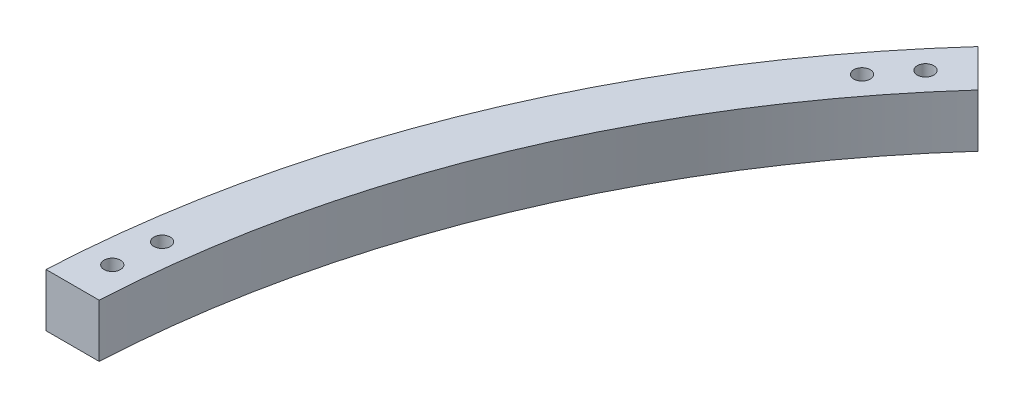
ISO-10303-21;
HEADER;
FILE_DESCRIPTION(('STEP AP214'),'2;1');
FILE_NAME('part.step','',(''),(''),'','','');
FILE_SCHEMA(('AUTOMOTIVE_DESIGN { 1 0 10303 214 1 1 1 1 }'));
ENDSEC;
DATA;
#1=APPLICATION_CONTEXT('core data for automotive mechanical design processes');
#2=APPLICATION_PROTOCOL_DEFINITION('international standard','automotive_design',2000,#1);
#3=PRODUCT_CONTEXT('',#1,'mechanical');
#4=PRODUCT('Part','Part','',(#3));
#5=PRODUCT_RELATED_PRODUCT_CATEGORY('part','',(#4));
#6=PRODUCT_DEFINITION_FORMATION('','',#4);
#7=PRODUCT_DEFINITION_CONTEXT('part definition',#1,'design');
#8=PRODUCT_DEFINITION('design','',#6,#7);
#9=PRODUCT_DEFINITION_SHAPE('','',#8);
#10=(LENGTH_UNIT() NAMED_UNIT(*) SI_UNIT(.MILLI.,.METRE.));
#11=(NAMED_UNIT(*) PLANE_ANGLE_UNIT() SI_UNIT($,.RADIAN.));
#12=(NAMED_UNIT(*) SI_UNIT($,.STERADIAN.) SOLID_ANGLE_UNIT());
#13=UNCERTAINTY_MEASURE_WITH_UNIT(LENGTH_MEASURE(1.E-05),#10,'distance_accuracy_value','');
#14=(GEOMETRIC_REPRESENTATION_CONTEXT(3) GLOBAL_UNCERTAINTY_ASSIGNED_CONTEXT((#13)) GLOBAL_UNIT_ASSIGNED_CONTEXT((#10,
#11,#12)) REPRESENTATION_CONTEXT('',''));
#15=CARTESIAN_POINT('',(0.,0.,0.));
#16=DIRECTION('',(0.,0.,1.));
#17=DIRECTION('',(1.,0.,0.));
#18=AXIS2_PLACEMENT_3D('',#15,#16,#17);
#19=CARTESIAN_POINT('',(0.,5.,0.));
#20=DIRECTION('',(0.,-1.,0.));
#21=DIRECTION('',(0.,0.,-1.));
#22=AXIS2_PLACEMENT_3D('',#19,#20,#21);
#23=CYLINDRICAL_SURFACE('',#22,190.);
#24=CARTESIAN_POINT('',(0.,-5.,0.));
#25=DIRECTION('',(0.,1.,0.));
#26=DIRECTION('',(0.,0.,1.));
#27=AXIS2_PLACEMENT_3D('',#24,#25,#26);
#28=CIRCLE('',#27,190.);
#29=CARTESIAN_POINT('',(-141.235146461853,-5.,-127.093010838122));
#30=VERTEX_POINT('',#29);
#31=CARTESIAN_POINT('',(-189.736659610103,-5.,-10.));
#32=VERTEX_POINT('',#31);
#33=EDGE_CURVE('E101',#30,#32,#28,.T.);
#34=ORIENTED_EDGE('',*,*,#33,.F.);
#35=DIRECTION('',(0.,-1.,0.));
#36=VECTOR('',#35,1.);
#37=CARTESIAN_POINT('',(-141.235146461853,5.,-127.093010838122));
#38=LINE('',#37,#36);
#39=CARTESIAN_POINT('',(-141.235146461853,5.,-127.093010838122));
#40=VERTEX_POINT('',#39);
#41=EDGE_CURVE('E11',#40,#30,#38,.T.);
#42=ORIENTED_EDGE('',*,*,#41,.F.);
#43=CARTESIAN_POINT('',(0.,5.,0.));
#44=DIRECTION('',(0.,1.,0.));
#45=DIRECTION('',(0.,0.,1.));
#46=AXIS2_PLACEMENT_3D('',#43,#44,#45);
#47=CIRCLE('',#46,190.);
#48=CARTESIAN_POINT('',(-189.736659610103,5.,-10.));
#49=VERTEX_POINT('',#48);
#50=EDGE_CURVE('E94',#40,#49,#47,.T.);
#51=ORIENTED_EDGE('',*,*,#50,.T.);
#52=DIRECTION('',(0.,-1.,0.));
#53=VECTOR('',#52,1.);
#54=CARTESIAN_POINT('',(-189.736659610103,5.,-10.));
#55=LINE('',#54,#53);
#56=EDGE_CURVE('E75',#49,#32,#55,.T.);
#57=ORIENTED_EDGE('',*,*,#56,.T.);
#58=EDGE_LOOP('',(#34,#42,#51,#57));
#59=FACE_BOUND('',#58,.T.);
#60=ADVANCED_FACE('F37',(#59),#23,.F.);
#61=CARTESIAN_POINT('',(-7.07106781186545,5.,7.07106781186545));
#62=DIRECTION('',(0.707106781186548,0.,-0.707106781186548));
#63=DIRECTION('',(-0.707106781186548,0.,-0.707106781186548));
#64=AXIS2_PLACEMENT_3D('',#61,#62,#63);
#65=PLANE('',#64);
#66=DIRECTION('',(0.707106781186548,0.,0.707106781186548));
#67=VECTOR('',#66,1.);
#68=CARTESIAN_POINT('',(-7.07106781186545,-5.,7.07106781186545));
#69=LINE('',#68,#67);
#70=CARTESIAN_POINT('',(-148.315536730121,-5.,-134.17340110639));
#71=VERTEX_POINT('',#70);
#72=EDGE_CURVE('E88',#71,#30,#69,.T.);
#73=ORIENTED_EDGE('',*,*,#72,.F.);
#74=DIRECTION('',(0.,-1.,0.));
#75=VECTOR('',#74,1.);
#76=CARTESIAN_POINT('',(-148.315536730121,5.,-134.17340110639));
#77=LINE('',#76,#75);
#78=CARTESIAN_POINT('',(-148.315536730121,5.,-134.17340110639));
#79=VERTEX_POINT('',#78);
#80=EDGE_CURVE('E45',#79,#71,#77,.T.);
#81=ORIENTED_EDGE('',*,*,#80,.F.);
#82=DIRECTION('',(0.707106781186548,0.,0.707106781186548));
#83=VECTOR('',#82,1.);
#84=CARTESIAN_POINT('',(-7.07106781186545,5.,7.07106781186545));
#85=LINE('',#84,#83);
#86=EDGE_CURVE('E86',#79,#40,#85,.T.);
#87=ORIENTED_EDGE('',*,*,#86,.T.);
#88=ORIENTED_EDGE('',*,*,#41,.T.);
#89=EDGE_LOOP('',(#73,#81,#87,#88));
#90=FACE_BOUND('',#89,.T.);
#91=ADVANCED_FACE('F84',(#90),#65,.T.);
#92=CARTESIAN_POINT('',(0.,5.,0.));
#93=DIRECTION('',(0.,-1.,0.));
#94=DIRECTION('',(0.,0.,-1.));
#95=AXIS2_PLACEMENT_3D('',#92,#93,#94);
#96=CYLINDRICAL_SURFACE('',#95,200.);
#97=CARTESIAN_POINT('',(0.,-5.,0.));
#98=DIRECTION('',(0.,1.,0.));
#99=DIRECTION('',(0.,0.,1.));
#100=AXIS2_PLACEMENT_3D('',#97,#98,#99);
#101=CIRCLE('',#100,200.);
#102=CARTESIAN_POINT('',(-199.749843554382,-5.,-10.));
#103=VERTEX_POINT('',#102);
#104=EDGE_CURVE('E68',#71,#103,#101,.T.);
#105=ORIENTED_EDGE('',*,*,#104,.T.);
#106=DIRECTION('',(0.,-1.,0.));
#107=VECTOR('',#106,1.);
#108=CARTESIAN_POINT('',(-199.749843554382,5.,-10.));
#109=LINE('',#108,#107);
#110=CARTESIAN_POINT('',(-199.749843554382,5.,-10.));
#111=VERTEX_POINT('',#110);
#112=EDGE_CURVE('E89',#111,#103,#109,.T.);
#113=ORIENTED_EDGE('',*,*,#112,.F.);
#114=CARTESIAN_POINT('',(0.,5.,0.));
#115=DIRECTION('',(0.,1.,0.));
#116=DIRECTION('',(0.,0.,1.));
#117=AXIS2_PLACEMENT_3D('',#114,#115,#116);
#118=CIRCLE('',#117,200.);
#119=EDGE_CURVE('E90',#79,#111,#118,.T.);
#120=ORIENTED_EDGE('',*,*,#119,.F.);
#121=ORIENTED_EDGE('',*,*,#80,.T.);
#122=EDGE_LOOP('',(#105,#113,#120,#121));
#123=FACE_BOUND('',#122,.T.);
#124=ADVANCED_FACE('F91',(#123),#96,.T.);
#125=CARTESIAN_POINT('',(0.,5.,-10.));
#126=DIRECTION('',(0.,0.,-1.));
#127=DIRECTION('',(-1.,0.,0.));
#128=AXIS2_PLACEMENT_3D('',#125,#126,#127);
#129=PLANE('',#128);
#130=DIRECTION('',(1.,0.,0.));
#131=VECTOR('',#130,1.);
#132=CARTESIAN_POINT('',(0.,-5.,-10.));
#133=LINE('',#132,#131);
#134=EDGE_CURVE('E96',#103,#32,#133,.T.);
#135=ORIENTED_EDGE('',*,*,#134,.T.);
#136=ORIENTED_EDGE('',*,*,#56,.F.);
#137=DIRECTION('',(1.,0.,0.));
#138=VECTOR('',#137,1.);
#139=CARTESIAN_POINT('',(0.,5.,-10.));
#140=LINE('',#139,#138);
#141=EDGE_CURVE('E53',#111,#49,#140,.T.);
#142=ORIENTED_EDGE('',*,*,#141,.F.);
#143=ORIENTED_EDGE('',*,*,#112,.T.);
#144=EDGE_LOOP('',(#135,#136,#142,#143));
#145=FACE_BOUND('',#144,.T.);
#146=ADVANCED_FACE('F111',(#145),#129,.F.);
#147=CARTESIAN_POINT('',(0.,5.,0.));
#148=DIRECTION('',(0.,1.,0.));
#149=DIRECTION('',(0.,0.,1.));
#150=AXIS2_PLACEMENT_3D('',#147,#148,#149);
#151=PLANE('',#150);
#152=CARTESIAN_POINT('',(-194.25796612789,5.,-16.995369835792));
#153=DIRECTION('',(0.,1.,0.));
#154=DIRECTION('',(0.,0.,1.));
#155=AXIS2_PLACEMENT_3D('',#152,#153,#154);
#156=CIRCLE('',#155,1.55);
#157=CARTESIAN_POINT('',(-194.25796612789,5.,-15.445369835792));
#158=VERTEX_POINT('',#157);
#159=EDGE_CURVE('E154',#158,#158,#156,.T.);
#160=ORIENTED_EDGE('',*,*,#159,.F.);
#161=EDGE_LOOP('',(#160));
#162=FACE_BOUND('',#161,.T.);
#163=CARTESIAN_POINT('',(-149.3786664082,5.,-125.343583888876));
#164=DIRECTION('',(0.,1.,0.));
#165=DIRECTION('',(0.,0.,1.));
#166=AXIS2_PLACEMENT_3D('',#163,#164,#165);
#167=CIRCLE('',#166,1.55);
#168=CARTESIAN_POINT('',(-149.3786664082,5.,-123.793583888876));
#169=VERTEX_POINT('',#168);
#170=EDGE_CURVE('E156',#169,#169,#167,.T.);
#171=ORIENTED_EDGE('',*,*,#170,.F.);
#172=EDGE_LOOP('',(#171));
#173=FACE_BOUND('',#172,.T.);
#174=CARTESIAN_POINT('',(-154.70390135679,5.,-118.708478656702));
#175=DIRECTION('',(0.,1.,0.));
#176=DIRECTION('',(0.,0.,1.));
#177=AXIS2_PLACEMENT_3D('',#174,#175,#176);
#178=CIRCLE('',#177,1.55);
#179=CARTESIAN_POINT('',(-154.70390135679,5.,-117.158478656702));
#180=VERTEX_POINT('',#179);
#181=EDGE_CURVE('E164',#180,#180,#178,.T.);
#182=ORIENTED_EDGE('',*,*,#181,.F.);
#183=EDGE_LOOP('',(#182));
#184=FACE_BOUND('',#183,.T.);
#185=CARTESIAN_POINT('',(-193.331747967893,5.,-25.4526074829087));
#186=DIRECTION('',(0.,1.,0.));
#187=DIRECTION('',(0.,0.,1.));
#188=AXIS2_PLACEMENT_3D('',#185,#186,#187);
#189=CIRCLE('',#188,1.55);
#190=CARTESIAN_POINT('',(-193.331747967893,5.,-23.9026074829087));
#191=VERTEX_POINT('',#190);
#192=EDGE_CURVE('E170',#191,#191,#189,.T.);
#193=ORIENTED_EDGE('',*,*,#192,.F.);
#194=EDGE_LOOP('',(#193));
#195=FACE_BOUND('',#194,.T.);
#196=ORIENTED_EDGE('',*,*,#50,.F.);
#197=ORIENTED_EDGE('',*,*,#86,.F.);
#198=ORIENTED_EDGE('',*,*,#119,.T.);
#199=ORIENTED_EDGE('',*,*,#141,.T.);
#200=EDGE_LOOP('',(#196,#197,#198,#199));
#201=FACE_BOUND('',#200,.T.);
#202=ADVANCED_FACE('F93',(#162,#173,#184,#195,#201),#151,.T.);
#203=CARTESIAN_POINT('',(0.,-5.,0.));
#204=DIRECTION('',(0.,1.,0.));
#205=DIRECTION('',(0.,0.,1.));
#206=AXIS2_PLACEMENT_3D('',#203,#204,#205);
#207=PLANE('',#206);
#208=CARTESIAN_POINT('',(-194.25796612789,-5.,-16.995369835792));
#209=DIRECTION('',(0.,1.,0.));
#210=DIRECTION('',(0.,0.,1.));
#211=AXIS2_PLACEMENT_3D('',#208,#209,#210);
#212=CIRCLE('',#211,1.55);
#213=CARTESIAN_POINT('',(-194.25796612789,-5.,-15.445369835792));
#214=VERTEX_POINT('',#213);
#215=EDGE_CURVE('E151',#214,#214,#212,.T.);
#216=ORIENTED_EDGE('',*,*,#215,.T.);
#217=EDGE_LOOP('',(#216));
#218=FACE_BOUND('',#217,.T.);
#219=CARTESIAN_POINT('',(-149.3786664082,-5.,-125.343583888876));
#220=DIRECTION('',(0.,1.,0.));
#221=DIRECTION('',(0.,0.,1.));
#222=AXIS2_PLACEMENT_3D('',#219,#220,#221);
#223=CIRCLE('',#222,1.55);
#224=CARTESIAN_POINT('',(-149.3786664082,-5.,-123.793583888876));
#225=VERTEX_POINT('',#224);
#226=EDGE_CURVE('E161',#225,#225,#223,.T.);
#227=ORIENTED_EDGE('',*,*,#226,.T.);
#228=EDGE_LOOP('',(#227));
#229=FACE_BOUND('',#228,.T.);
#230=CARTESIAN_POINT('',(-154.70390135679,-5.,-118.708478656702));
#231=DIRECTION('',(0.,1.,0.));
#232=DIRECTION('',(0.,0.,1.));
#233=AXIS2_PLACEMENT_3D('',#230,#231,#232);
#234=CIRCLE('',#233,1.55);
#235=CARTESIAN_POINT('',(-154.70390135679,-5.,-117.158478656702));
#236=VERTEX_POINT('',#235);
#237=EDGE_CURVE('E167',#236,#236,#234,.T.);
#238=ORIENTED_EDGE('',*,*,#237,.T.);
#239=EDGE_LOOP('',(#238));
#240=FACE_BOUND('',#239,.T.);
#241=CARTESIAN_POINT('',(-193.331747967893,-5.,-25.4526074829087));
#242=DIRECTION('',(0.,1.,0.));
#243=DIRECTION('',(0.,0.,1.));
#244=AXIS2_PLACEMENT_3D('',#241,#242,#243);
#245=CIRCLE('',#244,1.55);
#246=CARTESIAN_POINT('',(-193.331747967893,-5.,-23.9026074829087));
#247=VERTEX_POINT('',#246);
#248=EDGE_CURVE('E104',#247,#247,#245,.T.);
#249=ORIENTED_EDGE('',*,*,#248,.T.);
#250=EDGE_LOOP('',(#249));
#251=FACE_BOUND('',#250,.T.);
#252=ORIENTED_EDGE('',*,*,#33,.T.);
#253=ORIENTED_EDGE('',*,*,#134,.F.);
#254=ORIENTED_EDGE('',*,*,#104,.F.);
#255=ORIENTED_EDGE('',*,*,#72,.T.);
#256=EDGE_LOOP('',(#252,#253,#254,#255));
#257=FACE_BOUND('',#256,.T.);
#258=ADVANCED_FACE('F113',(#218,#229,#240,#251,#257),#207,.F.);
#259=CARTESIAN_POINT('',(-193.331747967893,5.,-25.4526074829087));
#260=DIRECTION('',(0.,1.,0.));
#261=DIRECTION('',(0.,0.,1.));
#262=AXIS2_PLACEMENT_3D('',#259,#260,#261);
#263=CYLINDRICAL_SURFACE('',#262,1.55);
#264=ORIENTED_EDGE('',*,*,#248,.F.);
#265=EDGE_LOOP('',(#264));
#266=FACE_BOUND('',#265,.T.);
#267=ORIENTED_EDGE('',*,*,#192,.T.);
#268=EDGE_LOOP('',(#267));
#269=FACE_BOUND('',#268,.T.);
#270=ADVANCED_FACE('F127',(#266,#269),#263,.F.);
#271=CARTESIAN_POINT('',(-154.70390135679,5.,-118.708478656702));
#272=DIRECTION('',(0.,1.,0.));
#273=DIRECTION('',(0.,0.,1.));
#274=AXIS2_PLACEMENT_3D('',#271,#272,#273);
#275=CYLINDRICAL_SURFACE('',#274,1.55);
#276=ORIENTED_EDGE('',*,*,#237,.F.);
#277=EDGE_LOOP('',(#276));
#278=FACE_BOUND('',#277,.T.);
#279=ORIENTED_EDGE('',*,*,#181,.T.);
#280=EDGE_LOOP('',(#279));
#281=FACE_BOUND('',#280,.T.);
#282=ADVANCED_FACE('F134',(#278,#281),#275,.F.);
#283=CARTESIAN_POINT('',(-149.3786664082,5.,-125.343583888876));
#284=DIRECTION('',(0.,1.,0.));
#285=DIRECTION('',(0.,0.,1.));
#286=AXIS2_PLACEMENT_3D('',#283,#284,#285);
#287=CYLINDRICAL_SURFACE('',#286,1.55);
#288=ORIENTED_EDGE('',*,*,#226,.F.);
#289=EDGE_LOOP('',(#288));
#290=FACE_BOUND('',#289,.T.);
#291=ORIENTED_EDGE('',*,*,#170,.T.);
#292=EDGE_LOOP('',(#291));
#293=FACE_BOUND('',#292,.T.);
#294=ADVANCED_FACE('F138',(#290,#293),#287,.F.);
#295=CARTESIAN_POINT('',(-194.25796612789,5.,-16.995369835792));
#296=DIRECTION('',(0.,1.,0.));
#297=DIRECTION('',(0.,0.,1.));
#298=AXIS2_PLACEMENT_3D('',#295,#296,#297);
#299=CYLINDRICAL_SURFACE('',#298,1.55);
#300=ORIENTED_EDGE('',*,*,#215,.F.);
#301=EDGE_LOOP('',(#300));
#302=FACE_BOUND('',#301,.T.);
#303=ORIENTED_EDGE('',*,*,#159,.T.);
#304=EDGE_LOOP('',(#303));
#305=FACE_BOUND('',#304,.T.);
#306=ADVANCED_FACE('F142',(#302,#305),#299,.F.);
#307=CLOSED_SHELL('',(#60,#91,#124,#146,#202,#258,#270,#282,#294,#306));
#308=MANIFOLD_SOLID_BREP('B2',#307);
#309=ADVANCED_BREP_SHAPE_REPRESENTATION('',(#18,#308),#14);
#310=SHAPE_DEFINITION_REPRESENTATION(#9,#309);
ENDSEC;
END-ISO-10303-21;
